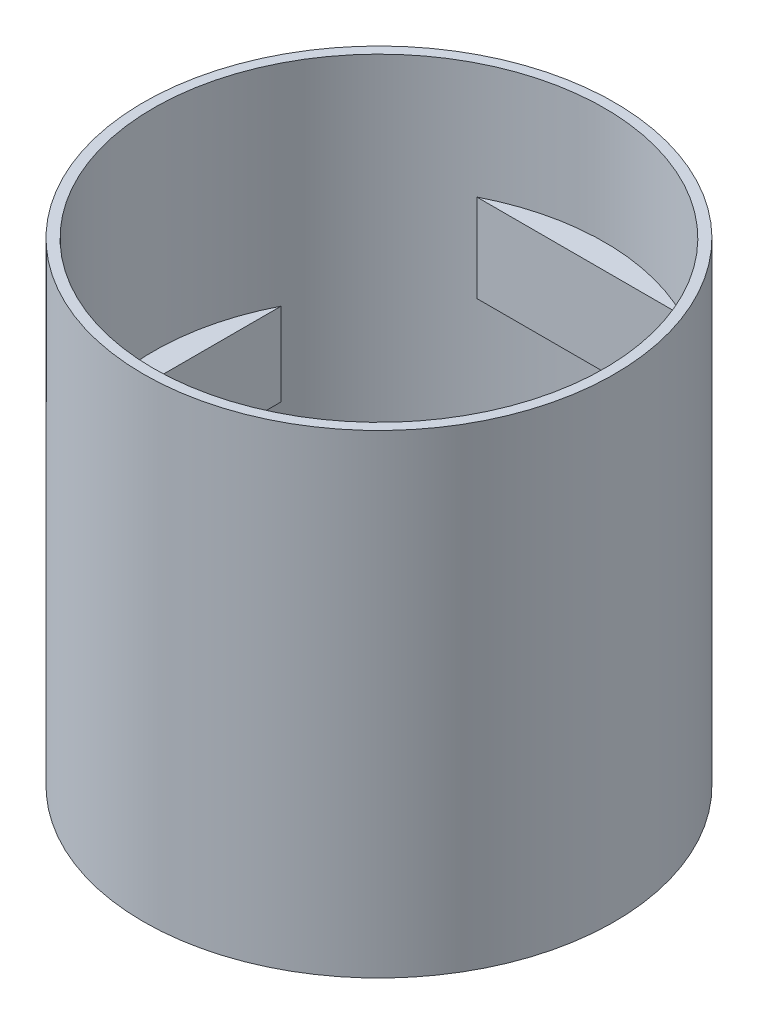
ISO-10303-21;
HEADER;
FILE_DESCRIPTION(('STEP AP214'),'2;1');
FILE_NAME('part.step','',(''),(''),'','','');
FILE_SCHEMA(('AUTOMOTIVE_DESIGN { 1 0 10303 214 1 1 1 1 }'));
ENDSEC;
DATA;
#1=APPLICATION_CONTEXT('core data for automotive mechanical design processes');
#2=APPLICATION_PROTOCOL_DEFINITION('international standard','automotive_design',2000,#1);
#3=PRODUCT_CONTEXT('',#1,'mechanical');
#4=PRODUCT('Part','Part','',(#3));
#5=PRODUCT_RELATED_PRODUCT_CATEGORY('part','',(#4));
#6=PRODUCT_DEFINITION_FORMATION('','',#4);
#7=PRODUCT_DEFINITION_CONTEXT('part definition',#1,'design');
#8=PRODUCT_DEFINITION('design','',#6,#7);
#9=PRODUCT_DEFINITION_SHAPE('','',#8);
#10=(LENGTH_UNIT() NAMED_UNIT(*) SI_UNIT(.MILLI.,.METRE.));
#11=(NAMED_UNIT(*) PLANE_ANGLE_UNIT() SI_UNIT($,.RADIAN.));
#12=(NAMED_UNIT(*) SI_UNIT($,.STERADIAN.) SOLID_ANGLE_UNIT());
#13=UNCERTAINTY_MEASURE_WITH_UNIT(LENGTH_MEASURE(1.E-05),#10,'distance_accuracy_value','');
#14=(GEOMETRIC_REPRESENTATION_CONTEXT(3) GLOBAL_UNCERTAINTY_ASSIGNED_CONTEXT((#13)) GLOBAL_UNIT_ASSIGNED_CONTEXT((#10,
#11,#12)) REPRESENTATION_CONTEXT('',''));
#15=CARTESIAN_POINT('',(0.,0.,0.));
#16=DIRECTION('',(0.,0.,1.));
#17=DIRECTION('',(1.,0.,0.));
#18=AXIS2_PLACEMENT_3D('',#15,#16,#17);
#19=CARTESIAN_POINT('',(0.,143.,0.));
#20=DIRECTION('',(0.,-1.,0.));
#21=DIRECTION('',(0.,0.,-1.));
#22=AXIS2_PLACEMENT_3D('',#19,#20,#21);
#23=CYLINDRICAL_SURFACE('',#22,68.);
#24=CARTESIAN_POINT('',(0.,108.,0.));
#25=DIRECTION('',(0.,1.,0.));
#26=DIRECTION('',(0.,0.,1.));
#27=AXIS2_PLACEMENT_3D('',#24,#25,#26);
#28=CIRCLE('',#27,68.);
#29=CARTESIAN_POINT('',(31.0071548865189,108.,-60.5190577078281));
#30=VERTEX_POINT('',#29);
#31=CARTESIAN_POINT('',(-31.0071548865185,108.,-60.5190577078283));
#32=VERTEX_POINT('',#31);
#33=EDGE_CURVE('E104',#30,#32,#28,.T.);
#34=ORIENTED_EDGE('',*,*,#33,.F.);
#35=DIRECTION('',(0.,-1.,0.));
#36=VECTOR('',#35,1.);
#37=CARTESIAN_POINT('',(31.0071548865189,108.,-60.5190577078281));
#38=LINE('',#37,#36);
#39=CARTESIAN_POINT('',(31.0071548865189,81.5,-60.5190577078281));
#40=VERTEX_POINT('',#39);
#41=EDGE_CURVE('E110',#30,#40,#38,.T.);
#42=ORIENTED_EDGE('',*,*,#41,.T.);
#43=CARTESIAN_POINT('',(0.,81.5,0.));
#44=DIRECTION('',(0.,1.,0.));
#45=DIRECTION('',(0.,0.,1.));
#46=AXIS2_PLACEMENT_3D('',#43,#44,#45);
#47=CIRCLE('',#46,68.);
#48=CARTESIAN_POINT('',(-31.0071548865184,81.5,-60.5190577078283));
#49=VERTEX_POINT('',#48);
#50=EDGE_CURVE('E107',#40,#49,#47,.T.);
#51=ORIENTED_EDGE('',*,*,#50,.T.);
#52=DIRECTION('',(0.,-1.,0.));
#53=VECTOR('',#52,1.);
#54=CARTESIAN_POINT('',(-31.0071548865185,108.,-60.5190577078283));
#55=LINE('',#54,#53);
#56=EDGE_CURVE('E114',#32,#49,#55,.T.);
#57=ORIENTED_EDGE('',*,*,#56,.F.);
#58=EDGE_LOOP('',(#34,#42,#51,#57));
#59=FACE_BOUND('',#58,.T.);
#60=CARTESIAN_POINT('',(0.,108.,0.));
#61=DIRECTION('',(0.,1.,0.));
#62=DIRECTION('',(0.,0.,1.));
#63=AXIS2_PLACEMENT_3D('',#60,#61,#62);
#64=CIRCLE('',#63,68.);
#65=CARTESIAN_POINT('',(-31.0071548865193,108.,60.5190577078279));
#66=VERTEX_POINT('',#65);
#67=CARTESIAN_POINT('',(31.0071548865181,108.,60.5190577078285));
#68=VERTEX_POINT('',#67);
#69=EDGE_CURVE('E124',#66,#68,#64,.T.);
#70=ORIENTED_EDGE('',*,*,#69,.F.);
#71=DIRECTION('',(0.,-1.,0.));
#72=VECTOR('',#71,1.);
#73=CARTESIAN_POINT('',(-31.0071548865193,108.,60.5190577078279));
#74=LINE('',#73,#72);
#75=CARTESIAN_POINT('',(-31.0071548865193,81.5,60.5190577078279));
#76=VERTEX_POINT('',#75);
#77=EDGE_CURVE('E132',#66,#76,#74,.T.);
#78=ORIENTED_EDGE('',*,*,#77,.T.);
#79=CARTESIAN_POINT('',(0.,81.5,0.));
#80=DIRECTION('',(0.,1.,0.));
#81=DIRECTION('',(0.,0.,1.));
#82=AXIS2_PLACEMENT_3D('',#79,#80,#81);
#83=CIRCLE('',#82,68.);
#84=CARTESIAN_POINT('',(31.007154886518,81.5,60.5190577078285));
#85=VERTEX_POINT('',#84);
#86=EDGE_CURVE('E125',#76,#85,#83,.T.);
#87=ORIENTED_EDGE('',*,*,#86,.T.);
#88=DIRECTION('',(0.,-1.,0.));
#89=VECTOR('',#88,1.);
#90=CARTESIAN_POINT('',(31.0071548865181,108.,60.5190577078285));
#91=LINE('',#90,#89);
#92=EDGE_CURVE('E127',#68,#85,#91,.T.);
#93=ORIENTED_EDGE('',*,*,#92,.F.);
#94=EDGE_LOOP('',(#70,#78,#87,#93));
#95=FACE_BOUND('',#94,.T.);
#96=CARTESIAN_POINT('',(0.,79.5,0.));
#97=DIRECTION('',(0.,1.,0.));
#98=DIRECTION('',(0.,0.,1.));
#99=AXIS2_PLACEMENT_3D('',#96,#97,#98);
#100=CIRCLE('',#99,68.);
#101=CARTESIAN_POINT('',(60.519057707828,79.5,31.0071548865191));
#102=VERTEX_POINT('',#101);
#103=CARTESIAN_POINT('',(60.5190577078285,79.5,-31.0071548865181));
#104=VERTEX_POINT('',#103);
#105=EDGE_CURVE('E138',#102,#104,#100,.T.);
#106=ORIENTED_EDGE('',*,*,#105,.F.);
#107=DIRECTION('',(0.,-1.,0.));
#108=VECTOR('',#107,1.);
#109=CARTESIAN_POINT('',(60.519057707828,79.5,31.0071548865191));
#110=LINE('',#109,#108);
#111=CARTESIAN_POINT('',(60.519057707828,54.5,31.0071548865191));
#112=VERTEX_POINT('',#111);
#113=EDGE_CURVE('E148',#102,#112,#110,.T.);
#114=ORIENTED_EDGE('',*,*,#113,.T.);
#115=CARTESIAN_POINT('',(0.,54.5,0.));
#116=DIRECTION('',(0.,1.,0.));
#117=DIRECTION('',(0.,0.,1.));
#118=AXIS2_PLACEMENT_3D('',#115,#116,#117);
#119=CIRCLE('',#118,68.);
#120=CARTESIAN_POINT('',(60.5190577078285,54.5,-31.0071548865182));
#121=VERTEX_POINT('',#120);
#122=EDGE_CURVE('E139',#112,#121,#119,.T.);
#123=ORIENTED_EDGE('',*,*,#122,.T.);
#124=DIRECTION('',(0.,-1.,0.));
#125=VECTOR('',#124,1.);
#126=CARTESIAN_POINT('',(60.5190577078285,79.5,-31.0071548865181));
#127=LINE('',#126,#125);
#128=EDGE_CURVE('E141',#104,#121,#127,.T.);
#129=ORIENTED_EDGE('',*,*,#128,.F.);
#130=EDGE_LOOP('',(#106,#114,#123,#129));
#131=FACE_BOUND('',#130,.T.);
#132=CARTESIAN_POINT('',(0.,79.5,0.));
#133=DIRECTION('',(0.,1.,0.));
#134=DIRECTION('',(0.,0.,1.));
#135=AXIS2_PLACEMENT_3D('',#132,#133,#134);
#136=CIRCLE('',#135,68.);
#137=CARTESIAN_POINT('',(-60.5190577078282,79.5,-31.0071548865187));
#138=VERTEX_POINT('',#137);
#139=CARTESIAN_POINT('',(-60.5190577078282,79.5,31.0071548865187));
#140=VERTEX_POINT('',#139);
#141=EDGE_CURVE('E154',#138,#140,#136,.T.);
#142=ORIENTED_EDGE('',*,*,#141,.F.);
#143=DIRECTION('',(0.,-1.,0.));
#144=VECTOR('',#143,1.);
#145=CARTESIAN_POINT('',(-60.5190577078282,79.5,-31.0071548865187));
#146=LINE('',#145,#144);
#147=CARTESIAN_POINT('',(-60.5190577078282,54.5,-31.0071548865187));
#148=VERTEX_POINT('',#147);
#149=EDGE_CURVE('E164',#138,#148,#146,.T.);
#150=ORIENTED_EDGE('',*,*,#149,.T.);
#151=CARTESIAN_POINT('',(0.,54.5,0.));
#152=DIRECTION('',(0.,1.,0.));
#153=DIRECTION('',(0.,0.,1.));
#154=AXIS2_PLACEMENT_3D('',#151,#152,#153);
#155=CIRCLE('',#154,68.);
#156=CARTESIAN_POINT('',(-60.5190577078282,54.5,31.0071548865186));
#157=VERTEX_POINT('',#156);
#158=EDGE_CURVE('E155',#148,#157,#155,.T.);
#159=ORIENTED_EDGE('',*,*,#158,.T.);
#160=DIRECTION('',(0.,-1.,0.));
#161=VECTOR('',#160,1.);
#162=CARTESIAN_POINT('',(-60.5190577078282,79.5,31.0071548865187));
#163=LINE('',#162,#161);
#164=EDGE_CURVE('E157',#140,#157,#163,.T.);
#165=ORIENTED_EDGE('',*,*,#164,.F.);
#166=EDGE_LOOP('',(#142,#150,#159,#165));
#167=FACE_BOUND('',#166,.T.);
#168=CARTESIAN_POINT('',(0.,143.,0.));
#169=DIRECTION('',(0.,1.,0.));
#170=DIRECTION('',(0.,0.,1.));
#171=AXIS2_PLACEMENT_3D('',#168,#169,#170);
#172=CIRCLE('',#171,68.);
#173=CARTESIAN_POINT('',(0.,143.,68.));
#174=VERTEX_POINT('',#173);
#175=EDGE_CURVE('E43',#174,#174,#172,.T.);
#176=ORIENTED_EDGE('',*,*,#175,.T.);
#177=EDGE_LOOP('',(#176));
#178=FACE_BOUND('',#177,.T.);
#179=CARTESIAN_POINT('',(0.,0.,0.));
#180=DIRECTION('',(0.,1.,0.));
#181=DIRECTION('',(0.,0.,1.));
#182=AXIS2_PLACEMENT_3D('',#179,#180,#181);
#183=CIRCLE('',#182,68.);
#184=CARTESIAN_POINT('',(0.,0.,68.));
#185=VERTEX_POINT('',#184);
#186=EDGE_CURVE('E167',#185,#185,#183,.T.);
#187=ORIENTED_EDGE('',*,*,#186,.F.);
#188=EDGE_LOOP('',(#187));
#189=FACE_BOUND('',#188,.T.);
#190=ADVANCED_FACE('F35',(#59,#95,#131,#167,#178,#189),#23,.F.);
#191=CARTESIAN_POINT('',(0.,143.,0.));
#192=DIRECTION('',(0.,-1.,0.));
#193=DIRECTION('',(0.,0.,-1.));
#194=AXIS2_PLACEMENT_3D('',#191,#192,#193);
#195=CYLINDRICAL_SURFACE('',#194,71.);
#196=CARTESIAN_POINT('',(0.,143.,0.));
#197=DIRECTION('',(0.,1.,0.));
#198=DIRECTION('',(0.,0.,1.));
#199=AXIS2_PLACEMENT_3D('',#196,#197,#198);
#200=CIRCLE('',#199,71.);
#201=CARTESIAN_POINT('',(0.,143.,71.));
#202=VERTEX_POINT('',#201);
#203=EDGE_CURVE('E11',#202,#202,#200,.T.);
#204=ORIENTED_EDGE('',*,*,#203,.F.);
#205=EDGE_LOOP('',(#204));
#206=FACE_BOUND('',#205,.T.);
#207=CARTESIAN_POINT('',(0.,0.,0.));
#208=DIRECTION('',(0.,1.,0.));
#209=DIRECTION('',(0.,0.,1.));
#210=AXIS2_PLACEMENT_3D('',#207,#208,#209);
#211=CIRCLE('',#210,71.);
#212=CARTESIAN_POINT('',(0.,0.,71.));
#213=VERTEX_POINT('',#212);
#214=EDGE_CURVE('E38',#213,#213,#211,.T.);
#215=ORIENTED_EDGE('',*,*,#214,.T.);
#216=EDGE_LOOP('',(#215));
#217=FACE_BOUND('',#216,.T.);
#218=ADVANCED_FACE('F175',(#206,#217),#195,.T.);
#219=CARTESIAN_POINT('',(0.,143.,0.));
#220=DIRECTION('',(0.,1.,0.));
#221=DIRECTION('',(0.,0.,1.));
#222=AXIS2_PLACEMENT_3D('',#219,#220,#221);
#223=PLANE('',#222);
#224=ORIENTED_EDGE('',*,*,#175,.F.);
#225=EDGE_LOOP('',(#224));
#226=FACE_BOUND('',#225,.T.);
#227=ORIENTED_EDGE('',*,*,#203,.T.);
#228=EDGE_LOOP('',(#227));
#229=FACE_BOUND('',#228,.T.);
#230=ADVANCED_FACE('F180',(#226,#229),#223,.T.);
#231=CARTESIAN_POINT('',(0.,0.,0.));
#232=DIRECTION('',(0.,1.,0.));
#233=DIRECTION('',(0.,0.,1.));
#234=AXIS2_PLACEMENT_3D('',#231,#232,#233);
#235=PLANE('',#234);
#236=ORIENTED_EDGE('',*,*,#186,.T.);
#237=EDGE_LOOP('',(#236));
#238=FACE_BOUND('',#237,.T.);
#239=ORIENTED_EDGE('',*,*,#214,.F.);
#240=EDGE_LOOP('',(#239));
#241=FACE_BOUND('',#240,.T.);
#242=ADVANCED_FACE('F177',(#238,#241),#235,.F.);
#243=CARTESIAN_POINT('',(-60.5190577078282,79.5,0.));
#244=DIRECTION('',(-1.,0.,0.));
#245=DIRECTION('',(0.,0.,1.));
#246=AXIS2_PLACEMENT_3D('',#243,#244,#245);
#247=PLANE('',#246);
#248=DIRECTION('',(0.,0.,-1.));
#249=VECTOR('',#248,1.);
#250=CARTESIAN_POINT('',(-60.5190577078282,54.5,0.));
#251=LINE('',#250,#249);
#252=EDGE_CURVE('E151',#157,#148,#251,.T.);
#253=ORIENTED_EDGE('',*,*,#252,.T.);
#254=ORIENTED_EDGE('',*,*,#149,.F.);
#255=DIRECTION('',(0.,0.,-1.));
#256=VECTOR('',#255,1.);
#257=CARTESIAN_POINT('',(-60.5190577078282,79.5,0.));
#258=LINE('',#257,#256);
#259=EDGE_CURVE('E152',#140,#138,#258,.T.);
#260=ORIENTED_EDGE('',*,*,#259,.F.);
#261=ORIENTED_EDGE('',*,*,#164,.T.);
#262=EDGE_LOOP('',(#253,#254,#260,#261));
#263=FACE_BOUND('',#262,.T.);
#264=ADVANCED_FACE('F179',(#263),#247,.F.);
#265=CARTESIAN_POINT('',(0.,79.5,0.));
#266=DIRECTION('',(0.,1.,0.));
#267=DIRECTION('',(0.,0.,1.));
#268=AXIS2_PLACEMENT_3D('',#265,#266,#267);
#269=PLANE('',#268);
#270=ORIENTED_EDGE('',*,*,#259,.T.);
#271=ORIENTED_EDGE('',*,*,#141,.T.);
#272=EDGE_LOOP('',(#270,#271));
#273=FACE_BOUND('',#272,.T.);
#274=ADVANCED_FACE('F186',(#273),#269,.T.);
#275=CARTESIAN_POINT('',(0.,54.5,0.));
#276=DIRECTION('',(0.,1.,0.));
#277=DIRECTION('',(0.,0.,1.));
#278=AXIS2_PLACEMENT_3D('',#275,#276,#277);
#279=PLANE('',#278);
#280=ORIENTED_EDGE('',*,*,#252,.F.);
#281=ORIENTED_EDGE('',*,*,#158,.F.);
#282=EDGE_LOOP('',(#280,#281));
#283=FACE_BOUND('',#282,.T.);
#284=ADVANCED_FACE('F225',(#283),#279,.F.);
#285=CARTESIAN_POINT('',(60.5190577078282,79.5,4.61322299177025E-13));
#286=DIRECTION('',(1.,0.,0.));
#287=DIRECTION('',(0.,0.,-1.));
#288=AXIS2_PLACEMENT_3D('',#285,#286,#287);
#289=PLANE('',#288);
#290=DIRECTION('',(0.,0.,1.));
#291=VECTOR('',#290,1.);
#292=CARTESIAN_POINT('',(60.5190577078282,54.5,4.61322299177025E-13));
#293=LINE('',#292,#291);
#294=EDGE_CURVE('E135',#121,#112,#293,.T.);
#295=ORIENTED_EDGE('',*,*,#294,.T.);
#296=ORIENTED_EDGE('',*,*,#113,.F.);
#297=DIRECTION('',(0.,0.,1.));
#298=VECTOR('',#297,1.);
#299=CARTESIAN_POINT('',(60.5190577078282,79.5,4.61322299177025E-13));
#300=LINE('',#299,#298);
#301=EDGE_CURVE('E136',#104,#102,#300,.T.);
#302=ORIENTED_EDGE('',*,*,#301,.F.);
#303=ORIENTED_EDGE('',*,*,#128,.T.);
#304=EDGE_LOOP('',(#295,#296,#302,#303));
#305=FACE_BOUND('',#304,.T.);
#306=ADVANCED_FACE('F235',(#305),#289,.F.);
#307=CARTESIAN_POINT('',(0.,79.5,0.));
#308=DIRECTION('',(0.,1.,0.));
#309=DIRECTION('',(0.,0.,1.));
#310=AXIS2_PLACEMENT_3D('',#307,#308,#309);
#311=PLANE('',#310);
#312=ORIENTED_EDGE('',*,*,#301,.T.);
#313=ORIENTED_EDGE('',*,*,#105,.T.);
#314=EDGE_LOOP('',(#312,#313));
#315=FACE_BOUND('',#314,.T.);
#316=ADVANCED_FACE('F246',(#315),#311,.T.);
#317=CARTESIAN_POINT('',(0.,54.5,0.));
#318=DIRECTION('',(0.,1.,0.));
#319=DIRECTION('',(0.,0.,1.));
#320=AXIS2_PLACEMENT_3D('',#317,#318,#319);
#321=PLANE('',#320);
#322=ORIENTED_EDGE('',*,*,#294,.F.);
#323=ORIENTED_EDGE('',*,*,#122,.F.);
#324=EDGE_LOOP('',(#322,#323));
#325=FACE_BOUND('',#324,.T.);
#326=ADVANCED_FACE('F257',(#325),#321,.F.);
#327=CARTESIAN_POINT('',(-6.82757002781996E-13,108.,60.5190577078282));
#328=DIRECTION('',(0.,0.,1.));
#329=DIRECTION('',(1.,0.,0.));
#330=AXIS2_PLACEMENT_3D('',#327,#328,#329);
#331=PLANE('',#330);
#332=DIRECTION('',(-1.,0.,0.));
#333=VECTOR('',#332,1.);
#334=CARTESIAN_POINT('',(-6.82757002781996E-13,81.5,60.5190577078282));
#335=LINE('',#334,#333);
#336=EDGE_CURVE('E57',#85,#76,#335,.T.);
#337=ORIENTED_EDGE('',*,*,#336,.T.);
#338=ORIENTED_EDGE('',*,*,#77,.F.);
#339=DIRECTION('',(-1.,0.,0.));
#340=VECTOR('',#339,1.);
#341=CARTESIAN_POINT('',(-6.82757002781996E-13,108.,60.5190577078282));
#342=LINE('',#341,#340);
#343=EDGE_CURVE('E122',#68,#66,#342,.T.);
#344=ORIENTED_EDGE('',*,*,#343,.F.);
#345=ORIENTED_EDGE('',*,*,#92,.T.);
#346=EDGE_LOOP('',(#337,#338,#344,#345));
#347=FACE_BOUND('',#346,.T.);
#348=ADVANCED_FACE('F266',(#347),#331,.F.);
#349=CARTESIAN_POINT('',(0.,108.,0.));
#350=DIRECTION('',(0.,1.,0.));
#351=DIRECTION('',(0.,0.,1.));
#352=AXIS2_PLACEMENT_3D('',#349,#350,#351);
#353=PLANE('',#352);
#354=ORIENTED_EDGE('',*,*,#343,.T.);
#355=ORIENTED_EDGE('',*,*,#69,.T.);
#356=EDGE_LOOP('',(#354,#355));
#357=FACE_BOUND('',#356,.T.);
#358=ADVANCED_FACE('F282',(#357),#353,.T.);
#359=CARTESIAN_POINT('',(0.,81.5,0.));
#360=DIRECTION('',(0.,1.,0.));
#361=DIRECTION('',(0.,0.,1.));
#362=AXIS2_PLACEMENT_3D('',#359,#360,#361);
#363=PLANE('',#362);
#364=ORIENTED_EDGE('',*,*,#336,.F.);
#365=ORIENTED_EDGE('',*,*,#86,.F.);
#366=EDGE_LOOP('',(#364,#365));
#367=FACE_BOUND('',#366,.T.);
#368=ADVANCED_FACE('F293',(#367),#363,.F.);
#369=CARTESIAN_POINT('',(2.58340487539134E-13,108.,-60.5190577078282));
#370=DIRECTION('',(0.,0.,-1.));
#371=DIRECTION('',(-1.,0.,0.));
#372=AXIS2_PLACEMENT_3D('',#369,#370,#371);
#373=PLANE('',#372);
#374=DIRECTION('',(1.,0.,0.));
#375=VECTOR('',#374,1.);
#376=CARTESIAN_POINT('',(2.58340487539134E-13,81.5,-60.5190577078282));
#377=LINE('',#376,#375);
#378=EDGE_CURVE('E50',#49,#40,#377,.T.);
#379=ORIENTED_EDGE('',*,*,#378,.T.);
#380=ORIENTED_EDGE('',*,*,#41,.F.);
#381=DIRECTION('',(1.,0.,0.));
#382=VECTOR('',#381,1.);
#383=CARTESIAN_POINT('',(2.58340487539134E-13,108.,-60.5190577078282));
#384=LINE('',#383,#382);
#385=EDGE_CURVE('E100',#32,#30,#384,.T.);
#386=ORIENTED_EDGE('',*,*,#385,.F.);
#387=ORIENTED_EDGE('',*,*,#56,.T.);
#388=EDGE_LOOP('',(#379,#380,#386,#387));
#389=FACE_BOUND('',#388,.T.);
#390=ADVANCED_FACE('F111',(#389),#373,.F.);
#391=CARTESIAN_POINT('',(0.,108.,0.));
#392=DIRECTION('',(0.,1.,0.));
#393=DIRECTION('',(0.,0.,1.));
#394=AXIS2_PLACEMENT_3D('',#391,#392,#393);
#395=PLANE('',#394);
#396=ORIENTED_EDGE('',*,*,#385,.T.);
#397=ORIENTED_EDGE('',*,*,#33,.T.);
#398=EDGE_LOOP('',(#396,#397));
#399=FACE_BOUND('',#398,.T.);
#400=ADVANCED_FACE('F102',(#399),#395,.T.);
#401=CARTESIAN_POINT('',(0.,81.5,0.));
#402=DIRECTION('',(0.,1.,0.));
#403=DIRECTION('',(0.,0.,1.));
#404=AXIS2_PLACEMENT_3D('',#401,#402,#403);
#405=PLANE('',#404);
#406=ORIENTED_EDGE('',*,*,#378,.F.);
#407=ORIENTED_EDGE('',*,*,#50,.F.);
#408=EDGE_LOOP('',(#406,#407));
#409=FACE_BOUND('',#408,.T.);
#410=ADVANCED_FACE('F321',(#409),#405,.F.);
#411=CLOSED_SHELL('',(#190,#218,#230,#242,#264,#274,#284,#306,#316,#326,#348,#358,#368,#390,
#400,#410));
#412=MANIFOLD_SOLID_BREP('B2',#411);
#413=ADVANCED_BREP_SHAPE_REPRESENTATION('',(#18,#412),#14);
#414=SHAPE_DEFINITION_REPRESENTATION(#9,#413);
ENDSEC;
END-ISO-10303-21;
